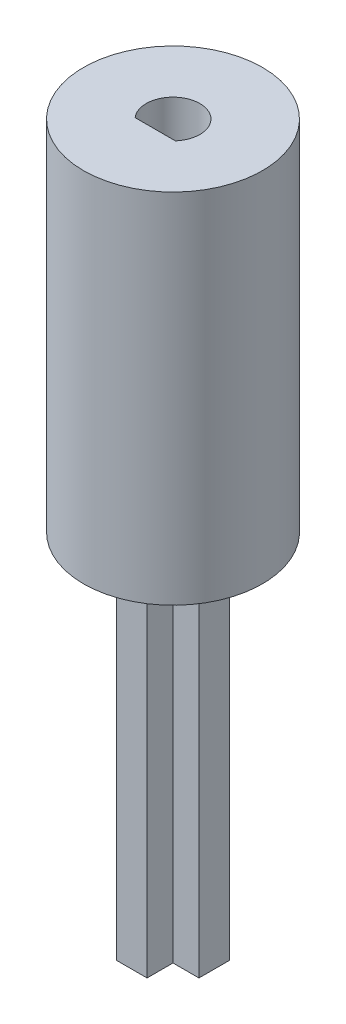
ISO-10303-21;
HEADER;
FILE_DESCRIPTION(('STEP AP214'),'2;1');
FILE_NAME('part.step','',(''),(''),'','','');
FILE_SCHEMA(('AUTOMOTIVE_DESIGN { 1 0 10303 214 1 1 1 1 }'));
ENDSEC;
DATA;
#1=APPLICATION_CONTEXT('core data for automotive mechanical design processes');
#2=APPLICATION_PROTOCOL_DEFINITION('international standard','automotive_design',2000,#1);
#3=PRODUCT_CONTEXT('',#1,'mechanical');
#4=PRODUCT('Part','Part','',(#3));
#5=PRODUCT_RELATED_PRODUCT_CATEGORY('part','',(#4));
#6=PRODUCT_DEFINITION_FORMATION('','',#4);
#7=PRODUCT_DEFINITION_CONTEXT('part definition',#1,'design');
#8=PRODUCT_DEFINITION('design','',#6,#7);
#9=PRODUCT_DEFINITION_SHAPE('','',#8);
#10=(LENGTH_UNIT() NAMED_UNIT(*) SI_UNIT(.MILLI.,.METRE.));
#11=(NAMED_UNIT(*) PLANE_ANGLE_UNIT() SI_UNIT($,.RADIAN.));
#12=(NAMED_UNIT(*) SI_UNIT($,.STERADIAN.) SOLID_ANGLE_UNIT());
#13=UNCERTAINTY_MEASURE_WITH_UNIT(LENGTH_MEASURE(1.E-05),#10,'distance_accuracy_value','');
#14=(GEOMETRIC_REPRESENTATION_CONTEXT(3) GLOBAL_UNCERTAINTY_ASSIGNED_CONTEXT((#13)) GLOBAL_UNIT_ASSIGNED_CONTEXT((#10,
#11,#12)) REPRESENTATION_CONTEXT('',''));
#15=CARTESIAN_POINT('',(0.,0.,0.));
#16=DIRECTION('',(0.,0.,1.));
#17=DIRECTION('',(1.,0.,0.));
#18=AXIS2_PLACEMENT_3D('',#15,#16,#17);
#19=CARTESIAN_POINT('',(0.850000000000001,20.,0.850000000000007));
#20=DIRECTION('',(-1.,0.,0.));
#21=DIRECTION('',(0.,0.,1.));
#22=AXIS2_PLACEMENT_3D('',#19,#20,#21);
#23=PLANE('',#22);
#24=DIRECTION('',(0.,0.,-1.));
#25=VECTOR('',#24,1.);
#26=CARTESIAN_POINT('',(0.850000000000001,0.,0.850000000000007));
#27=LINE('',#26,#25);
#28=CARTESIAN_POINT('',(0.850000000000001,0.,2.3));
#29=VERTEX_POINT('',#28);
#30=CARTESIAN_POINT('',(0.850000000000001,0.,0.850000000000007));
#31=VERTEX_POINT('',#30);
#32=EDGE_CURVE('E178',#29,#31,#27,.T.);
#33=ORIENTED_EDGE('',*,*,#32,.T.);
#34=DIRECTION('',(0.,-1.,0.));
#35=VECTOR('',#34,1.);
#36=CARTESIAN_POINT('',(0.850000000000001,20.,0.850000000000007));
#37=LINE('',#36,#35);
#38=CARTESIAN_POINT('',(0.850000000000001,20.,0.850000000000007));
#39=VERTEX_POINT('',#38);
#40=EDGE_CURVE('E11',#39,#31,#37,.T.);
#41=ORIENTED_EDGE('',*,*,#40,.F.);
#42=DIRECTION('',(0.,0.,-1.));
#43=VECTOR('',#42,1.);
#44=CARTESIAN_POINT('',(0.850000000000001,20.,0.850000000000007));
#45=LINE('',#44,#43);
#46=CARTESIAN_POINT('',(0.850000000000001,20.,2.3));
#47=VERTEX_POINT('',#46);
#48=EDGE_CURVE('E202',#47,#39,#45,.T.);
#49=ORIENTED_EDGE('',*,*,#48,.F.);
#50=DIRECTION('',(0.,-1.,0.));
#51=VECTOR('',#50,1.);
#52=CARTESIAN_POINT('',(0.850000000000001,20.,2.3));
#53=LINE('',#52,#51);
#54=EDGE_CURVE('E177',#47,#29,#53,.T.);
#55=ORIENTED_EDGE('',*,*,#54,.T.);
#56=EDGE_LOOP('',(#33,#41,#49,#55));
#57=FACE_BOUND('',#56,.T.);
#58=ADVANCED_FACE('F39',(#57),#23,.F.);
#59=CARTESIAN_POINT('',(0.850000000000001,20.,0.850000000000007));
#60=DIRECTION('',(0.,0.,-1.));
#61=DIRECTION('',(-1.,0.,0.));
#62=AXIS2_PLACEMENT_3D('',#59,#60,#61);
#63=PLANE('',#62);
#64=DIRECTION('',(1.,0.,0.));
#65=VECTOR('',#64,1.);
#66=CARTESIAN_POINT('',(0.850000000000001,0.,0.850000000000007));
#67=LINE('',#66,#65);
#68=CARTESIAN_POINT('',(2.29999999999999,0.,0.850000000000007));
#69=VERTEX_POINT('',#68);
#70=EDGE_CURVE('E181',#31,#69,#67,.T.);
#71=ORIENTED_EDGE('',*,*,#70,.T.);
#72=DIRECTION('',(0.,-1.,0.));
#73=VECTOR('',#72,1.);
#74=CARTESIAN_POINT('',(2.29999999999999,20.,0.850000000000007));
#75=LINE('',#74,#73);
#76=CARTESIAN_POINT('',(2.29999999999999,20.,0.850000000000007));
#77=VERTEX_POINT('',#76);
#78=EDGE_CURVE('E46',#77,#69,#75,.T.);
#79=ORIENTED_EDGE('',*,*,#78,.F.);
#80=DIRECTION('',(1.,0.,0.));
#81=VECTOR('',#80,1.);
#82=CARTESIAN_POINT('',(0.850000000000001,20.,0.850000000000007));
#83=LINE('',#82,#81);
#84=EDGE_CURVE('E115',#39,#77,#83,.T.);
#85=ORIENTED_EDGE('',*,*,#84,.F.);
#86=ORIENTED_EDGE('',*,*,#40,.T.);
#87=EDGE_LOOP('',(#71,#79,#85,#86));
#88=FACE_BOUND('',#87,.T.);
#89=ADVANCED_FACE('F311',(#88),#63,.F.);
#90=CARTESIAN_POINT('',(2.29999999999999,20.,-0.849999999999993));
#91=DIRECTION('',(-1.,0.,0.));
#92=DIRECTION('',(0.,0.,1.));
#93=AXIS2_PLACEMENT_3D('',#90,#91,#92);
#94=PLANE('',#93);
#95=DIRECTION('',(0.,0.,-1.));
#96=VECTOR('',#95,1.);
#97=CARTESIAN_POINT('',(2.29999999999999,0.,-0.849999999999993));
#98=LINE('',#97,#96);
#99=CARTESIAN_POINT('',(2.29999999999999,0.,-0.849999999999993));
#100=VERTEX_POINT('',#99);
#101=EDGE_CURVE('E184',#69,#100,#98,.T.);
#102=ORIENTED_EDGE('',*,*,#101,.T.);
#103=DIRECTION('',(0.,-1.,0.));
#104=VECTOR('',#103,1.);
#105=CARTESIAN_POINT('',(2.29999999999999,20.,-0.849999999999993));
#106=LINE('',#105,#104);
#107=CARTESIAN_POINT('',(2.29999999999999,20.,-0.849999999999993));
#108=VERTEX_POINT('',#107);
#109=EDGE_CURVE('E219',#108,#100,#106,.T.);
#110=ORIENTED_EDGE('',*,*,#109,.F.);
#111=DIRECTION('',(0.,0.,-1.));
#112=VECTOR('',#111,1.);
#113=CARTESIAN_POINT('',(2.29999999999999,20.,-0.849999999999993));
#114=LINE('',#113,#112);
#115=EDGE_CURVE('E227',#77,#108,#114,.T.);
#116=ORIENTED_EDGE('',*,*,#115,.F.);
#117=ORIENTED_EDGE('',*,*,#78,.T.);
#118=EDGE_LOOP('',(#102,#110,#116,#117));
#119=FACE_BOUND('',#118,.T.);
#120=ADVANCED_FACE('F225',(#119),#94,.F.);
#121=CARTESIAN_POINT('',(0.85,20.,-0.849999999999993));
#122=DIRECTION('',(0.,0.,1.));
#123=DIRECTION('',(1.,0.,0.));
#124=AXIS2_PLACEMENT_3D('',#121,#122,#123);
#125=PLANE('',#124);
#126=DIRECTION('',(-1.,0.,0.));
#127=VECTOR('',#126,1.);
#128=CARTESIAN_POINT('',(0.85,0.,-0.849999999999993));
#129=LINE('',#128,#127);
#130=CARTESIAN_POINT('',(0.85,0.,-0.849999999999993));
#131=VERTEX_POINT('',#130);
#132=EDGE_CURVE('E186',#100,#131,#129,.T.);
#133=ORIENTED_EDGE('',*,*,#132,.T.);
#134=DIRECTION('',(0.,-1.,0.));
#135=VECTOR('',#134,1.);
#136=CARTESIAN_POINT('',(0.85,20.,-0.849999999999993));
#137=LINE('',#136,#135);
#138=CARTESIAN_POINT('',(0.85,20.,-0.849999999999993));
#139=VERTEX_POINT('',#138);
#140=EDGE_CURVE('E216',#139,#131,#137,.T.);
#141=ORIENTED_EDGE('',*,*,#140,.F.);
#142=DIRECTION('',(-1.,0.,0.));
#143=VECTOR('',#142,1.);
#144=CARTESIAN_POINT('',(0.85,20.,-0.849999999999993));
#145=LINE('',#144,#143);
#146=EDGE_CURVE('E246',#108,#139,#145,.T.);
#147=ORIENTED_EDGE('',*,*,#146,.F.);
#148=ORIENTED_EDGE('',*,*,#109,.T.);
#149=EDGE_LOOP('',(#133,#141,#147,#148));
#150=FACE_BOUND('',#149,.T.);
#151=ADVANCED_FACE('F235',(#150),#125,.F.);
#152=CARTESIAN_POINT('',(0.85,20.,-2.3));
#153=DIRECTION('',(-1.,0.,0.));
#154=DIRECTION('',(0.,0.,1.));
#155=AXIS2_PLACEMENT_3D('',#152,#153,#154);
#156=PLANE('',#155);
#157=DIRECTION('',(0.,0.,-1.));
#158=VECTOR('',#157,1.);
#159=CARTESIAN_POINT('',(0.85,0.,-2.3));
#160=LINE('',#159,#158);
#161=CARTESIAN_POINT('',(0.85,0.,-2.3));
#162=VERTEX_POINT('',#161);
#163=EDGE_CURVE('E188',#131,#162,#160,.T.);
#164=ORIENTED_EDGE('',*,*,#163,.T.);
#165=DIRECTION('',(0.,-1.,0.));
#166=VECTOR('',#165,1.);
#167=CARTESIAN_POINT('',(0.85,20.,-2.3));
#168=LINE('',#167,#166);
#169=CARTESIAN_POINT('',(0.85,20.,-2.3));
#170=VERTEX_POINT('',#169);
#171=EDGE_CURVE('E213',#170,#162,#168,.T.);
#172=ORIENTED_EDGE('',*,*,#171,.F.);
#173=DIRECTION('',(0.,0.,-1.));
#174=VECTOR('',#173,1.);
#175=CARTESIAN_POINT('',(0.85,20.,-2.3));
#176=LINE('',#175,#174);
#177=EDGE_CURVE('E241',#139,#170,#176,.T.);
#178=ORIENTED_EDGE('',*,*,#177,.F.);
#179=ORIENTED_EDGE('',*,*,#140,.T.);
#180=EDGE_LOOP('',(#164,#172,#178,#179));
#181=FACE_BOUND('',#180,.T.);
#182=ADVANCED_FACE('F239',(#181),#156,.F.);
#183=CARTESIAN_POINT('',(-0.85,20.,-2.3));
#184=DIRECTION('',(0.,0.,1.));
#185=DIRECTION('',(1.,0.,0.));
#186=AXIS2_PLACEMENT_3D('',#183,#184,#185);
#187=PLANE('',#186);
#188=DIRECTION('',(-1.,0.,0.));
#189=VECTOR('',#188,1.);
#190=CARTESIAN_POINT('',(-0.85,0.,-2.3));
#191=LINE('',#190,#189);
#192=CARTESIAN_POINT('',(-0.85,0.,-2.3));
#193=VERTEX_POINT('',#192);
#194=EDGE_CURVE('E190',#162,#193,#191,.T.);
#195=ORIENTED_EDGE('',*,*,#194,.T.);
#196=DIRECTION('',(0.,-1.,0.));
#197=VECTOR('',#196,1.);
#198=CARTESIAN_POINT('',(-0.85,20.,-2.3));
#199=LINE('',#198,#197);
#200=CARTESIAN_POINT('',(-0.85,20.,-2.3));
#201=VERTEX_POINT('',#200);
#202=EDGE_CURVE('E210',#201,#193,#199,.T.);
#203=ORIENTED_EDGE('',*,*,#202,.F.);
#204=DIRECTION('',(-1.,0.,0.));
#205=VECTOR('',#204,1.);
#206=CARTESIAN_POINT('',(-0.85,20.,-2.3));
#207=LINE('',#206,#205);
#208=EDGE_CURVE('E245',#170,#201,#207,.T.);
#209=ORIENTED_EDGE('',*,*,#208,.F.);
#210=ORIENTED_EDGE('',*,*,#171,.T.);
#211=EDGE_LOOP('',(#195,#203,#209,#210));
#212=FACE_BOUND('',#211,.T.);
#213=ADVANCED_FACE('F325',(#212),#187,.F.);
#214=CARTESIAN_POINT('',(-0.85,20.,-2.3));
#215=DIRECTION('',(1.,0.,0.));
#216=DIRECTION('',(0.,0.,-1.));
#217=AXIS2_PLACEMENT_3D('',#214,#215,#216);
#218=PLANE('',#217);
#219=DIRECTION('',(0.,0.,1.));
#220=VECTOR('',#219,1.);
#221=CARTESIAN_POINT('',(-0.85,0.,-2.3));
#222=LINE('',#221,#220);
#223=CARTESIAN_POINT('',(-0.85,0.,-0.849999999999993));
#224=VERTEX_POINT('',#223);
#225=EDGE_CURVE('E192',#193,#224,#222,.T.);
#226=ORIENTED_EDGE('',*,*,#225,.T.);
#227=DIRECTION('',(0.,-1.,0.));
#228=VECTOR('',#227,1.);
#229=CARTESIAN_POINT('',(-0.85,20.,-0.849999999999993));
#230=LINE('',#229,#228);
#231=CARTESIAN_POINT('',(-0.85,20.,-0.849999999999993));
#232=VERTEX_POINT('',#231);
#233=EDGE_CURVE('E207',#232,#224,#230,.T.);
#234=ORIENTED_EDGE('',*,*,#233,.F.);
#235=DIRECTION('',(0.,0.,1.));
#236=VECTOR('',#235,1.);
#237=CARTESIAN_POINT('',(-0.85,20.,-2.3));
#238=LINE('',#237,#236);
#239=EDGE_CURVE('E170',#201,#232,#238,.T.);
#240=ORIENTED_EDGE('',*,*,#239,.F.);
#241=ORIENTED_EDGE('',*,*,#202,.T.);
#242=EDGE_LOOP('',(#226,#234,#240,#241));
#243=FACE_BOUND('',#242,.T.);
#244=ADVANCED_FACE('F254',(#243),#218,.F.);
#245=CARTESIAN_POINT('',(-2.30000000000001,20.,-0.849999999999993));
#246=DIRECTION('',(0.,0.,1.));
#247=DIRECTION('',(1.,0.,0.));
#248=AXIS2_PLACEMENT_3D('',#245,#246,#247);
#249=PLANE('',#248);
#250=DIRECTION('',(-1.,0.,0.));
#251=VECTOR('',#250,1.);
#252=CARTESIAN_POINT('',(-2.30000000000001,0.,-0.849999999999993));
#253=LINE('',#252,#251);
#254=CARTESIAN_POINT('',(-2.30000000000001,0.,-0.849999999999993));
#255=VERTEX_POINT('',#254);
#256=EDGE_CURVE('E194',#224,#255,#253,.T.);
#257=ORIENTED_EDGE('',*,*,#256,.T.);
#258=DIRECTION('',(0.,-1.,0.));
#259=VECTOR('',#258,1.);
#260=CARTESIAN_POINT('',(-2.30000000000001,20.,-0.849999999999993));
#261=LINE('',#260,#259);
#262=CARTESIAN_POINT('',(-2.30000000000001,20.,-0.849999999999993));
#263=VERTEX_POINT('',#262);
#264=EDGE_CURVE('E153',#263,#255,#261,.T.);
#265=ORIENTED_EDGE('',*,*,#264,.F.);
#266=DIRECTION('',(-1.,0.,0.));
#267=VECTOR('',#266,1.);
#268=CARTESIAN_POINT('',(-2.30000000000001,20.,-0.849999999999993));
#269=LINE('',#268,#267);
#270=EDGE_CURVE('E168',#232,#263,#269,.T.);
#271=ORIENTED_EDGE('',*,*,#270,.F.);
#272=ORIENTED_EDGE('',*,*,#233,.T.);
#273=EDGE_LOOP('',(#257,#265,#271,#272));
#274=FACE_BOUND('',#273,.T.);
#275=ADVANCED_FACE('F258',(#274),#249,.F.);
#276=CARTESIAN_POINT('',(-2.30000000000001,20.,-0.849999999999993));
#277=DIRECTION('',(1.,0.,0.));
#278=DIRECTION('',(0.,0.,-1.));
#279=AXIS2_PLACEMENT_3D('',#276,#277,#278);
#280=PLANE('',#279);
#281=DIRECTION('',(0.,0.,1.));
#282=VECTOR('',#281,1.);
#283=CARTESIAN_POINT('',(-2.30000000000001,0.,-0.849999999999993));
#284=LINE('',#283,#282);
#285=CARTESIAN_POINT('',(-2.30000000000001,0.,0.850000000000007));
#286=VERTEX_POINT('',#285);
#287=EDGE_CURVE('E150',#255,#286,#284,.T.);
#288=ORIENTED_EDGE('',*,*,#287,.T.);
#289=DIRECTION('',(0.,-1.,0.));
#290=VECTOR('',#289,1.);
#291=CARTESIAN_POINT('',(-2.30000000000001,20.,0.850000000000007));
#292=LINE('',#291,#290);
#293=CARTESIAN_POINT('',(-2.30000000000001,20.,0.850000000000007));
#294=VERTEX_POINT('',#293);
#295=EDGE_CURVE('E142',#294,#286,#292,.T.);
#296=ORIENTED_EDGE('',*,*,#295,.F.);
#297=DIRECTION('',(0.,0.,1.));
#298=VECTOR('',#297,1.);
#299=CARTESIAN_POINT('',(-2.30000000000001,20.,-0.849999999999993));
#300=LINE('',#299,#298);
#301=EDGE_CURVE('E147',#263,#294,#300,.T.);
#302=ORIENTED_EDGE('',*,*,#301,.F.);
#303=ORIENTED_EDGE('',*,*,#264,.T.);
#304=EDGE_LOOP('',(#288,#296,#302,#303));
#305=FACE_BOUND('',#304,.T.);
#306=ADVANCED_FACE('F144',(#305),#280,.F.);
#307=CARTESIAN_POINT('',(-2.30000000000001,20.,0.850000000000007));
#308=DIRECTION('',(0.,0.,-1.));
#309=DIRECTION('',(-1.,0.,0.));
#310=AXIS2_PLACEMENT_3D('',#307,#308,#309);
#311=PLANE('',#310);
#312=DIRECTION('',(1.,0.,0.));
#313=VECTOR('',#312,1.);
#314=CARTESIAN_POINT('',(-2.30000000000001,0.,0.850000000000007));
#315=LINE('',#314,#313);
#316=CARTESIAN_POINT('',(-0.85,0.,0.850000000000007));
#317=VERTEX_POINT('',#316);
#318=EDGE_CURVE('E197',#286,#317,#315,.T.);
#319=ORIENTED_EDGE('',*,*,#318,.T.);
#320=DIRECTION('',(0.,-1.,0.));
#321=VECTOR('',#320,1.);
#322=CARTESIAN_POINT('',(-0.85,20.,0.850000000000007));
#323=LINE('',#322,#321);
#324=CARTESIAN_POINT('',(-0.85,20.,0.850000000000007));
#325=VERTEX_POINT('',#324);
#326=EDGE_CURVE('E154',#325,#317,#323,.T.);
#327=ORIENTED_EDGE('',*,*,#326,.F.);
#328=DIRECTION('',(1.,0.,0.));
#329=VECTOR('',#328,1.);
#330=CARTESIAN_POINT('',(-2.30000000000001,20.,0.850000000000007));
#331=LINE('',#330,#329);
#332=EDGE_CURVE('E157',#294,#325,#331,.T.);
#333=ORIENTED_EDGE('',*,*,#332,.F.);
#334=ORIENTED_EDGE('',*,*,#295,.T.);
#335=EDGE_LOOP('',(#319,#327,#333,#334));
#336=FACE_BOUND('',#335,.T.);
#337=ADVANCED_FACE('F158',(#336),#311,.F.);
#338=CARTESIAN_POINT('',(-0.85,20.,0.850000000000007));
#339=DIRECTION('',(1.,0.,0.));
#340=DIRECTION('',(0.,0.,-1.));
#341=AXIS2_PLACEMENT_3D('',#338,#339,#340);
#342=PLANE('',#341);
#343=DIRECTION('',(0.,0.,1.));
#344=VECTOR('',#343,1.);
#345=CARTESIAN_POINT('',(-0.85,0.,0.850000000000007));
#346=LINE('',#345,#344);
#347=CARTESIAN_POINT('',(-0.849999999999999,0.,2.3));
#348=VERTEX_POINT('',#347);
#349=EDGE_CURVE('E199',#317,#348,#346,.T.);
#350=ORIENTED_EDGE('',*,*,#349,.T.);
#351=DIRECTION('',(0.,-1.,0.));
#352=VECTOR('',#351,1.);
#353=CARTESIAN_POINT('',(-0.849999999999999,20.,2.3));
#354=LINE('',#353,#352);
#355=CARTESIAN_POINT('',(-0.849999999999999,20.,2.3));
#356=VERTEX_POINT('',#355);
#357=EDGE_CURVE('E62',#356,#348,#354,.T.);
#358=ORIENTED_EDGE('',*,*,#357,.F.);
#359=DIRECTION('',(0.,0.,1.));
#360=VECTOR('',#359,1.);
#361=CARTESIAN_POINT('',(-0.85,20.,0.850000000000007));
#362=LINE('',#361,#360);
#363=EDGE_CURVE('E162',#325,#356,#362,.T.);
#364=ORIENTED_EDGE('',*,*,#363,.F.);
#365=ORIENTED_EDGE('',*,*,#326,.T.);
#366=EDGE_LOOP('',(#350,#358,#364,#365));
#367=FACE_BOUND('',#366,.T.);
#368=ADVANCED_FACE('F260',(#367),#342,.F.);
#369=CARTESIAN_POINT('',(-0.849999999999999,20.,2.3));
#370=DIRECTION('',(0.,0.,-1.));
#371=DIRECTION('',(-1.,0.,0.));
#372=AXIS2_PLACEMENT_3D('',#369,#370,#371);
#373=PLANE('',#372);
#374=DIRECTION('',(1.,0.,0.));
#375=VECTOR('',#374,1.);
#376=CARTESIAN_POINT('',(-0.849999999999999,0.,2.3));
#377=LINE('',#376,#375);
#378=EDGE_CURVE('E107',#348,#29,#377,.T.);
#379=ORIENTED_EDGE('',*,*,#378,.T.);
#380=ORIENTED_EDGE('',*,*,#54,.F.);
#381=DIRECTION('',(1.,0.,0.));
#382=VECTOR('',#381,1.);
#383=CARTESIAN_POINT('',(-0.849999999999999,20.,2.3));
#384=LINE('',#383,#382);
#385=EDGE_CURVE('E175',#356,#47,#384,.T.);
#386=ORIENTED_EDGE('',*,*,#385,.F.);
#387=ORIENTED_EDGE('',*,*,#357,.T.);
#388=EDGE_LOOP('',(#379,#380,#386,#387));
#389=FACE_BOUND('',#388,.T.);
#390=ADVANCED_FACE('F264',(#389),#373,.F.);
#391=CARTESIAN_POINT('',(0.,0.,0.));
#392=DIRECTION('',(0.,1.,0.));
#393=DIRECTION('',(0.,0.,1.));
#394=AXIS2_PLACEMENT_3D('',#391,#392,#393);
#395=PLANE('',#394);
#396=ORIENTED_EDGE('',*,*,#32,.F.);
#397=ORIENTED_EDGE('',*,*,#378,.F.);
#398=ORIENTED_EDGE('',*,*,#349,.F.);
#399=ORIENTED_EDGE('',*,*,#318,.F.);
#400=ORIENTED_EDGE('',*,*,#287,.F.);
#401=ORIENTED_EDGE('',*,*,#256,.F.);
#402=ORIENTED_EDGE('',*,*,#225,.F.);
#403=ORIENTED_EDGE('',*,*,#194,.F.);
#404=ORIENTED_EDGE('',*,*,#163,.F.);
#405=ORIENTED_EDGE('',*,*,#132,.F.);
#406=ORIENTED_EDGE('',*,*,#101,.F.);
#407=ORIENTED_EDGE('',*,*,#70,.F.);
#408=EDGE_LOOP('',(#396,#397,#398,#399,#400,#401,#402,#403,#404,#405,#406,#407));
#409=FACE_BOUND('',#408,.T.);
#410=ADVANCED_FACE('F231',(#409),#395,.F.);
#411=CARTESIAN_POINT('',(0.,20.,0.));
#412=DIRECTION('',(0.,1.,0.));
#413=DIRECTION('',(0.,0.,1.));
#414=AXIS2_PLACEMENT_3D('',#411,#412,#413);
#415=PLANE('',#414);
#416=CARTESIAN_POINT('',(0.,20.,0.));
#417=DIRECTION('',(0.,1.,0.));
#418=DIRECTION('',(0.,0.,1.));
#419=AXIS2_PLACEMENT_3D('',#416,#417,#418);
#420=CIRCLE('',#419,5.);
#421=CARTESIAN_POINT('',(0.,20.,5.));
#422=VERTEX_POINT('',#421);
#423=EDGE_CURVE('E268',#422,#422,#420,.T.);
#424=ORIENTED_EDGE('',*,*,#423,.F.);
#425=EDGE_LOOP('',(#424));
#426=FACE_BOUND('',#425,.T.);
#427=ORIENTED_EDGE('',*,*,#385,.T.);
#428=ORIENTED_EDGE('',*,*,#48,.T.);
#429=ORIENTED_EDGE('',*,*,#84,.T.);
#430=ORIENTED_EDGE('',*,*,#115,.T.);
#431=ORIENTED_EDGE('',*,*,#146,.T.);
#432=ORIENTED_EDGE('',*,*,#177,.T.);
#433=ORIENTED_EDGE('',*,*,#208,.T.);
#434=ORIENTED_EDGE('',*,*,#239,.T.);
#435=ORIENTED_EDGE('',*,*,#270,.T.);
#436=ORIENTED_EDGE('',*,*,#301,.T.);
#437=ORIENTED_EDGE('',*,*,#332,.T.);
#438=ORIENTED_EDGE('',*,*,#363,.T.);
#439=EDGE_LOOP('',(#427,#428,#429,#430,#431,#432,#433,#434,#435,#436,#437,#438));
#440=FACE_BOUND('',#439,.T.);
#441=ADVANCED_FACE('F165',(#426,#440),#415,.F.);
#442=CARTESIAN_POINT('',(0.,40.,0.));
#443=DIRECTION('',(0.,-1.,0.));
#444=DIRECTION('',(0.,0.,-1.));
#445=AXIS2_PLACEMENT_3D('',#442,#443,#444);
#446=CYLINDRICAL_SURFACE('',#445,5.);
#447=CARTESIAN_POINT('',(0.,40.,0.));
#448=DIRECTION('',(0.,1.,0.));
#449=DIRECTION('',(0.,0.,1.));
#450=AXIS2_PLACEMENT_3D('',#447,#448,#449);
#451=CIRCLE('',#450,5.);
#452=CARTESIAN_POINT('',(0.,40.,5.));
#453=VERTEX_POINT('',#452);
#454=EDGE_CURVE('E182',#453,#453,#451,.T.);
#455=ORIENTED_EDGE('',*,*,#454,.F.);
#456=EDGE_LOOP('',(#455));
#457=FACE_BOUND('',#456,.T.);
#458=ORIENTED_EDGE('',*,*,#423,.T.);
#459=EDGE_LOOP('',(#458));
#460=FACE_BOUND('',#459,.T.);
#461=ADVANCED_FACE('F307',(#457,#460),#446,.T.);
#462=CARTESIAN_POINT('',(0.,40.,0.));
#463=DIRECTION('',(0.,1.,0.));
#464=DIRECTION('',(0.,0.,1.));
#465=AXIS2_PLACEMENT_3D('',#462,#463,#464);
#466=PLANE('',#465);
#467=CARTESIAN_POINT('',(0.,40.,0.));
#468=DIRECTION('',(0.,1.,0.));
#469=DIRECTION('',(0.,0.,1.));
#470=AXIS2_PLACEMENT_3D('',#467,#468,#469);
#471=CIRCLE('',#470,1.5);
#472=CARTESIAN_POINT('',(1.125,40.,0.992156741649222));
#473=VERTEX_POINT('',#472);
#474=CARTESIAN_POINT('',(-1.125,40.,0.992156741649222));
#475=VERTEX_POINT('',#474);
#476=EDGE_CURVE('E53',#473,#475,#471,.T.);
#477=ORIENTED_EDGE('',*,*,#476,.F.);
#478=DIRECTION('',(1.,0.,0.));
#479=VECTOR('',#478,1.);
#480=CARTESIAN_POINT('',(-1.125,40.,0.992156741649222));
#481=LINE('',#480,#479);
#482=EDGE_CURVE('E278',#475,#473,#481,.T.);
#483=ORIENTED_EDGE('',*,*,#482,.F.);
#484=EDGE_LOOP('',(#477,#483));
#485=FACE_BOUND('',#484,.T.);
#486=ORIENTED_EDGE('',*,*,#454,.T.);
#487=EDGE_LOOP('',(#486));
#488=FACE_BOUND('',#487,.T.);
#489=ADVANCED_FACE('F300',(#485,#488),#466,.T.);
#490=CARTESIAN_POINT('',(0.,30.,0.));
#491=DIRECTION('',(0.,1.,0.));
#492=DIRECTION('',(0.,0.,1.));
#493=AXIS2_PLACEMENT_3D('',#490,#491,#492);
#494=CYLINDRICAL_SURFACE('',#493,1.5);
#495=ORIENTED_EDGE('',*,*,#476,.T.);
#496=DIRECTION('',(0.,1.,0.));
#497=VECTOR('',#496,1.);
#498=CARTESIAN_POINT('',(-1.125,30.,0.992156741649222));
#499=LINE('',#498,#497);
#500=CARTESIAN_POINT('',(-1.125,30.,0.992156741649222));
#501=VERTEX_POINT('',#500);
#502=EDGE_CURVE('E274',#501,#475,#499,.T.);
#503=ORIENTED_EDGE('',*,*,#502,.F.);
#504=CARTESIAN_POINT('',(0.,30.,0.));
#505=DIRECTION('',(0.,1.,0.));
#506=DIRECTION('',(0.,0.,1.));
#507=AXIS2_PLACEMENT_3D('',#504,#505,#506);
#508=CIRCLE('',#507,1.5);
#509=CARTESIAN_POINT('',(1.125,30.,0.992156741649222));
#510=VERTEX_POINT('',#509);
#511=EDGE_CURVE('E281',#510,#501,#508,.T.);
#512=ORIENTED_EDGE('',*,*,#511,.F.);
#513=DIRECTION('',(0.,1.,0.));
#514=VECTOR('',#513,1.);
#515=CARTESIAN_POINT('',(1.125,30.,0.992156741649222));
#516=LINE('',#515,#514);
#517=EDGE_CURVE('E271',#510,#473,#516,.T.);
#518=ORIENTED_EDGE('',*,*,#517,.T.);
#519=EDGE_LOOP('',(#495,#503,#512,#518));
#520=FACE_BOUND('',#519,.T.);
#521=ADVANCED_FACE('F298',(#520),#494,.F.);
#522=CARTESIAN_POINT('',(-1.125,30.,0.992156741649222));
#523=DIRECTION('',(0.,0.,1.));
#524=DIRECTION('',(1.,0.,0.));
#525=AXIS2_PLACEMENT_3D('',#522,#523,#524);
#526=PLANE('',#525);
#527=ORIENTED_EDGE('',*,*,#482,.T.);
#528=ORIENTED_EDGE('',*,*,#517,.F.);
#529=DIRECTION('',(1.,0.,0.));
#530=VECTOR('',#529,1.);
#531=CARTESIAN_POINT('',(-1.125,30.,0.992156741649222));
#532=LINE('',#531,#530);
#533=EDGE_CURVE('E276',#501,#510,#532,.T.);
#534=ORIENTED_EDGE('',*,*,#533,.F.);
#535=ORIENTED_EDGE('',*,*,#502,.T.);
#536=EDGE_LOOP('',(#527,#528,#534,#535));
#537=FACE_BOUND('',#536,.T.);
#538=ADVANCED_FACE('F295',(#537),#526,.F.);
#539=CARTESIAN_POINT('',(0.,30.,0.));
#540=DIRECTION('',(0.,1.,0.));
#541=DIRECTION('',(0.,0.,1.));
#542=AXIS2_PLACEMENT_3D('',#539,#540,#541);
#543=PLANE('',#542);
#544=ORIENTED_EDGE('',*,*,#511,.T.);
#545=ORIENTED_EDGE('',*,*,#533,.T.);
#546=EDGE_LOOP('',(#544,#545));
#547=FACE_BOUND('',#546,.T.);
#548=ADVANCED_FACE('F290',(#547),#543,.T.);
#549=CLOSED_SHELL('',(#58,#89,#120,#151,#182,#213,#244,#275,#306,#337,#368,#390,#410,#441,#461,
#489,#521,#538,#548));
#550=MANIFOLD_SOLID_BREP('B2',#549);
#551=ADVANCED_BREP_SHAPE_REPRESENTATION('',(#18,#550),#14);
#552=SHAPE_DEFINITION_REPRESENTATION(#9,#551);
ENDSEC;
END-ISO-10303-21;
